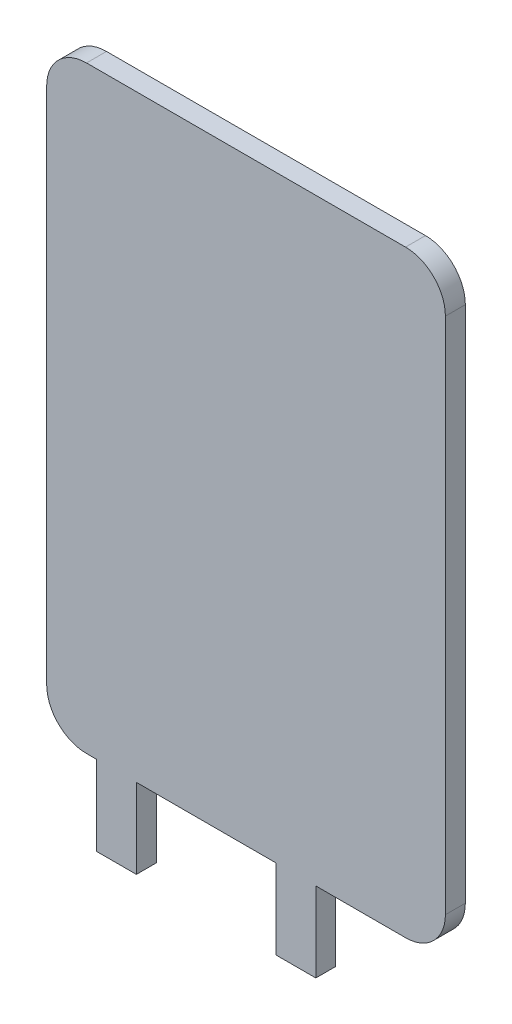
ISO-10303-21;
HEADER;
FILE_DESCRIPTION(('STEP AP214'),'2;1');
FILE_NAME('part.step','',(''),(''),'','','');
FILE_SCHEMA(('AUTOMOTIVE_DESIGN { 1 0 10303 214 1 1 1 1 }'));
ENDSEC;
DATA;
#1=APPLICATION_CONTEXT('core data for automotive mechanical design processes');
#2=APPLICATION_PROTOCOL_DEFINITION('international standard','automotive_design',2000,#1);
#3=PRODUCT_CONTEXT('',#1,'mechanical');
#4=PRODUCT('Part','Part','',(#3));
#5=PRODUCT_RELATED_PRODUCT_CATEGORY('part','',(#4));
#6=PRODUCT_DEFINITION_FORMATION('','',#4);
#7=PRODUCT_DEFINITION_CONTEXT('part definition',#1,'design');
#8=PRODUCT_DEFINITION('design','',#6,#7);
#9=PRODUCT_DEFINITION_SHAPE('','',#8);
#10=(LENGTH_UNIT() NAMED_UNIT(*) SI_UNIT(.MILLI.,.METRE.));
#11=(NAMED_UNIT(*) PLANE_ANGLE_UNIT() SI_UNIT($,.RADIAN.));
#12=(NAMED_UNIT(*) SI_UNIT($,.STERADIAN.) SOLID_ANGLE_UNIT());
#13=UNCERTAINTY_MEASURE_WITH_UNIT(LENGTH_MEASURE(1.E-05),#10,'distance_accuracy_value','');
#14=(GEOMETRIC_REPRESENTATION_CONTEXT(3) GLOBAL_UNCERTAINTY_ASSIGNED_CONTEXT((#13)) GLOBAL_UNIT_ASSIGNED_CONTEXT((#10,
#11,#12)) REPRESENTATION_CONTEXT('',''));
#15=CARTESIAN_POINT('',(0.,0.,0.));
#16=DIRECTION('',(0.,0.,1.));
#17=DIRECTION('',(1.,0.,0.));
#18=AXIS2_PLACEMENT_3D('',#15,#16,#17);
#19=CARTESIAN_POINT('',(20.,0.,2.));
#20=DIRECTION('',(1.,0.,0.));
#21=DIRECTION('',(0.,1.,0.));
#22=AXIS2_PLACEMENT_3D('',#19,#20,#21);
#23=PLANE('',#22);
#24=DIRECTION('',(0.,-1.,0.));
#25=VECTOR('',#24,1.);
#26=CARTESIAN_POINT('',(20.,0.,2.));
#27=LINE('',#26,#25);
#28=CARTESIAN_POINT('',(20.,26.,2.));
#29=VERTEX_POINT('',#28);
#30=CARTESIAN_POINT('',(20.,-26.,2.));
#31=VERTEX_POINT('',#30);
#32=EDGE_CURVE('E276',#29,#31,#27,.T.);
#33=ORIENTED_EDGE('',*,*,#32,.T.);
#34=DIRECTION('',(0.,0.,-1.));
#35=VECTOR('',#34,1.);
#36=CARTESIAN_POINT('',(20.,-26.,0.));
#37=LINE('',#36,#35);
#38=CARTESIAN_POINT('',(20.,-26.,0.));
#39=VERTEX_POINT('',#38);
#40=EDGE_CURVE('E231',#31,#39,#37,.T.);
#41=ORIENTED_EDGE('',*,*,#40,.T.);
#42=DIRECTION('',(0.,-1.,0.));
#43=VECTOR('',#42,1.);
#44=CARTESIAN_POINT('',(20.,0.,0.));
#45=LINE('',#44,#43);
#46=CARTESIAN_POINT('',(20.,26.,0.));
#47=VERTEX_POINT('',#46);
#48=EDGE_CURVE('E188',#47,#39,#45,.T.);
#49=ORIENTED_EDGE('',*,*,#48,.F.);
#50=DIRECTION('',(0.,0.,-1.));
#51=VECTOR('',#50,1.);
#52=CARTESIAN_POINT('',(20.,26.,2.));
#53=LINE('',#52,#51);
#54=EDGE_CURVE('E167',#47,#29,#53,.F.);
#55=ORIENTED_EDGE('',*,*,#54,.T.);
#56=EDGE_LOOP('',(#33,#41,#49,#55));
#57=FACE_BOUND('',#56,.T.);
#58=ADVANCED_FACE('F35',(#57),#23,.T.);
#59=CARTESIAN_POINT('',(0.,30.,2.));
#60=DIRECTION('',(0.,1.,0.));
#61=DIRECTION('',(0.,0.,1.));
#62=AXIS2_PLACEMENT_3D('',#59,#60,#61);
#63=PLANE('',#62);
#64=DIRECTION('',(1.,0.,0.));
#65=VECTOR('',#64,1.);
#66=CARTESIAN_POINT('',(0.,30.,0.));
#67=LINE('',#66,#65);
#68=CARTESIAN_POINT('',(-16.,30.,0.));
#69=VERTEX_POINT('',#68);
#70=CARTESIAN_POINT('',(16.,30.,0.));
#71=VERTEX_POINT('',#70);
#72=EDGE_CURVE('E191',#69,#71,#67,.T.);
#73=ORIENTED_EDGE('',*,*,#72,.F.);
#74=DIRECTION('',(0.,0.,-1.));
#75=VECTOR('',#74,1.);
#76=CARTESIAN_POINT('',(-16.,30.,2.));
#77=LINE('',#76,#75);
#78=CARTESIAN_POINT('',(-16.,30.,2.));
#79=VERTEX_POINT('',#78);
#80=EDGE_CURVE('E11',#69,#79,#77,.F.);
#81=ORIENTED_EDGE('',*,*,#80,.T.);
#82=DIRECTION('',(1.,0.,0.));
#83=VECTOR('',#82,1.);
#84=CARTESIAN_POINT('',(0.,30.,2.));
#85=LINE('',#84,#83);
#86=CARTESIAN_POINT('',(16.,30.,2.));
#87=VERTEX_POINT('',#86);
#88=EDGE_CURVE('E264',#79,#87,#85,.T.);
#89=ORIENTED_EDGE('',*,*,#88,.T.);
#90=DIRECTION('',(0.,0.,-1.));
#91=VECTOR('',#90,1.);
#92=CARTESIAN_POINT('',(16.,30.,2.));
#93=LINE('',#92,#91);
#94=EDGE_CURVE('E43',#87,#71,#93,.T.);
#95=ORIENTED_EDGE('',*,*,#94,.T.);
#96=EDGE_LOOP('',(#73,#81,#89,#95));
#97=FACE_BOUND('',#96,.T.);
#98=ADVANCED_FACE('F261',(#97),#63,.T.);
#99=CARTESIAN_POINT('',(-20.,0.,2.));
#100=DIRECTION('',(1.,0.,0.));
#101=DIRECTION('',(0.,1.,0.));
#102=AXIS2_PLACEMENT_3D('',#99,#100,#101);
#103=PLANE('',#102);
#104=DIRECTION('',(0.,-1.,0.));
#105=VECTOR('',#104,1.);
#106=CARTESIAN_POINT('',(-20.,0.,0.));
#107=LINE('',#106,#105);
#108=CARTESIAN_POINT('',(-20.,26.,0.));
#109=VERTEX_POINT('',#108);
#110=CARTESIAN_POINT('',(-20.,-26.,0.));
#111=VERTEX_POINT('',#110);
#112=EDGE_CURVE('E194',#109,#111,#107,.T.);
#113=ORIENTED_EDGE('',*,*,#112,.T.);
#114=DIRECTION('',(0.,0.,-1.));
#115=VECTOR('',#114,1.);
#116=CARTESIAN_POINT('',(-20.,-26.,2.));
#117=LINE('',#116,#115);
#118=CARTESIAN_POINT('',(-20.,-26.,2.));
#119=VERTEX_POINT('',#118);
#120=EDGE_CURVE('E58',#111,#119,#117,.F.);
#121=ORIENTED_EDGE('',*,*,#120,.T.);
#122=DIRECTION('',(0.,-1.,0.));
#123=VECTOR('',#122,1.);
#124=CARTESIAN_POINT('',(-20.,0.,2.));
#125=LINE('',#124,#123);
#126=CARTESIAN_POINT('',(-20.,26.,2.));
#127=VERTEX_POINT('',#126);
#128=EDGE_CURVE('E156',#127,#119,#125,.T.);
#129=ORIENTED_EDGE('',*,*,#128,.F.);
#130=DIRECTION('',(0.,0.,-1.));
#131=VECTOR('',#130,1.);
#132=CARTESIAN_POINT('',(-20.,26.,0.));
#133=LINE('',#132,#131);
#134=EDGE_CURVE('E253',#127,#109,#133,.T.);
#135=ORIENTED_EDGE('',*,*,#134,.T.);
#136=EDGE_LOOP('',(#113,#121,#129,#135));
#137=FACE_BOUND('',#136,.T.);
#138=ADVANCED_FACE('F275',(#137),#103,.F.);
#139=CARTESIAN_POINT('',(0.,-30.,2.));
#140=DIRECTION('',(0.,1.,0.));
#141=DIRECTION('',(0.,0.,1.));
#142=AXIS2_PLACEMENT_3D('',#139,#140,#141);
#143=PLANE('',#142);
#144=DIRECTION('',(1.,0.,0.));
#145=VECTOR('',#144,1.);
#146=CARTESIAN_POINT('',(0.,-30.,2.));
#147=LINE('',#146,#145);
#148=CARTESIAN_POINT('',(-16.,-30.,2.));
#149=VERTEX_POINT('',#148);
#150=CARTESIAN_POINT('',(-15.,-30.,2.));
#151=VERTEX_POINT('',#150);
#152=EDGE_CURVE('E146',#149,#151,#147,.T.);
#153=ORIENTED_EDGE('',*,*,#152,.F.);
#154=DIRECTION('',(0.,0.,-1.));
#155=VECTOR('',#154,1.);
#156=CARTESIAN_POINT('',(-16.,-30.,2.));
#157=LINE('',#156,#155);
#158=CARTESIAN_POINT('',(-16.,-30.,0.));
#159=VERTEX_POINT('',#158);
#160=EDGE_CURVE('E251',#149,#159,#157,.T.);
#161=ORIENTED_EDGE('',*,*,#160,.T.);
#162=DIRECTION('',(1.,0.,0.));
#163=VECTOR('',#162,1.);
#164=CARTESIAN_POINT('',(0.,-30.,0.));
#165=LINE('',#164,#163);
#166=CARTESIAN_POINT('',(-15.,-30.,0.));
#167=VERTEX_POINT('',#166);
#168=EDGE_CURVE('E164',#159,#167,#165,.T.);
#169=ORIENTED_EDGE('',*,*,#168,.T.);
#170=DIRECTION('',(0.,0.,-1.));
#171=VECTOR('',#170,1.);
#172=CARTESIAN_POINT('',(-15.,-30.,2.));
#173=LINE('',#172,#171);
#174=EDGE_CURVE('E161',#151,#167,#173,.T.);
#175=ORIENTED_EDGE('',*,*,#174,.F.);
#176=EDGE_LOOP('',(#153,#161,#169,#175));
#177=FACE_BOUND('',#176,.T.);
#178=ADVANCED_FACE('F162',(#177),#143,.F.);
#179=CARTESIAN_POINT('',(-15.,0.,2.));
#180=DIRECTION('',(1.,0.,0.));
#181=DIRECTION('',(0.,1.,0.));
#182=AXIS2_PLACEMENT_3D('',#179,#180,#181);
#183=PLANE('',#182);
#184=DIRECTION('',(0.,-1.,0.));
#185=VECTOR('',#184,1.);
#186=CARTESIAN_POINT('',(-15.,0.,0.));
#187=LINE('',#186,#185);
#188=CARTESIAN_POINT('',(-15.,-38.,0.));
#189=VERTEX_POINT('',#188);
#190=EDGE_CURVE('E197',#167,#189,#187,.T.);
#191=ORIENTED_EDGE('',*,*,#190,.T.);
#192=DIRECTION('',(0.,0.,-1.));
#193=VECTOR('',#192,1.);
#194=CARTESIAN_POINT('',(-15.,-38.,2.));
#195=LINE('',#194,#193);
#196=CARTESIAN_POINT('',(-15.,-38.,2.));
#197=VERTEX_POINT('',#196);
#198=EDGE_CURVE('E168',#197,#189,#195,.T.);
#199=ORIENTED_EDGE('',*,*,#198,.F.);
#200=DIRECTION('',(0.,-1.,0.));
#201=VECTOR('',#200,1.);
#202=CARTESIAN_POINT('',(-15.,0.,2.));
#203=LINE('',#202,#201);
#204=EDGE_CURVE('E151',#151,#197,#203,.T.);
#205=ORIENTED_EDGE('',*,*,#204,.F.);
#206=ORIENTED_EDGE('',*,*,#174,.T.);
#207=EDGE_LOOP('',(#191,#199,#205,#206));
#208=FACE_BOUND('',#207,.T.);
#209=ADVANCED_FACE('F170',(#208),#183,.F.);
#210=CARTESIAN_POINT('',(0.,-38.,2.));
#211=DIRECTION('',(0.,1.,0.));
#212=DIRECTION('',(0.,0.,1.));
#213=AXIS2_PLACEMENT_3D('',#210,#211,#212);
#214=PLANE('',#213);
#215=DIRECTION('',(1.,0.,0.));
#216=VECTOR('',#215,1.);
#217=CARTESIAN_POINT('',(0.,-38.,0.));
#218=LINE('',#217,#216);
#219=CARTESIAN_POINT('',(-11.,-38.,0.));
#220=VERTEX_POINT('',#219);
#221=EDGE_CURVE('E201',#189,#220,#218,.T.);
#222=ORIENTED_EDGE('',*,*,#221,.T.);
#223=DIRECTION('',(0.,0.,-1.));
#224=VECTOR('',#223,1.);
#225=CARTESIAN_POINT('',(-11.,-38.,2.));
#226=LINE('',#225,#224);
#227=CARTESIAN_POINT('',(-11.,-38.,2.));
#228=VERTEX_POINT('',#227);
#229=EDGE_CURVE('E227',#228,#220,#226,.T.);
#230=ORIENTED_EDGE('',*,*,#229,.F.);
#231=DIRECTION('',(1.,0.,0.));
#232=VECTOR('',#231,1.);
#233=CARTESIAN_POINT('',(0.,-38.,2.));
#234=LINE('',#233,#232);
#235=EDGE_CURVE('E173',#197,#228,#234,.T.);
#236=ORIENTED_EDGE('',*,*,#235,.F.);
#237=ORIENTED_EDGE('',*,*,#198,.T.);
#238=EDGE_LOOP('',(#222,#230,#236,#237));
#239=FACE_BOUND('',#238,.T.);
#240=ADVANCED_FACE('F449',(#239),#214,.F.);
#241=CARTESIAN_POINT('',(-11.,0.,2.));
#242=DIRECTION('',(1.,0.,0.));
#243=DIRECTION('',(0.,1.,0.));
#244=AXIS2_PLACEMENT_3D('',#241,#242,#243);
#245=PLANE('',#244);
#246=DIRECTION('',(0.,-1.,0.));
#247=VECTOR('',#246,1.);
#248=CARTESIAN_POINT('',(-11.,0.,0.));
#249=LINE('',#248,#247);
#250=CARTESIAN_POINT('',(-11.,-30.,0.));
#251=VERTEX_POINT('',#250);
#252=EDGE_CURVE('E204',#251,#220,#249,.T.);
#253=ORIENTED_EDGE('',*,*,#252,.F.);
#254=DIRECTION('',(0.,0.,-1.));
#255=VECTOR('',#254,1.);
#256=CARTESIAN_POINT('',(-11.,-30.,2.));
#257=LINE('',#256,#255);
#258=CARTESIAN_POINT('',(-11.,-30.,2.));
#259=VERTEX_POINT('',#258);
#260=EDGE_CURVE('E225',#259,#251,#257,.T.);
#261=ORIENTED_EDGE('',*,*,#260,.F.);
#262=DIRECTION('',(0.,-1.,0.));
#263=VECTOR('',#262,1.);
#264=CARTESIAN_POINT('',(-11.,0.,2.));
#265=LINE('',#264,#263);
#266=EDGE_CURVE('E175',#259,#228,#265,.T.);
#267=ORIENTED_EDGE('',*,*,#266,.T.);
#268=ORIENTED_EDGE('',*,*,#229,.T.);
#269=EDGE_LOOP('',(#253,#261,#267,#268));
#270=FACE_BOUND('',#269,.T.);
#271=ADVANCED_FACE('F325',(#270),#245,.T.);
#272=CARTESIAN_POINT('',(3.,-30.,0.));
#273=VERTEX_POINT('',#272);
#274=EDGE_CURVE('E199',#251,#273,#165,.T.);
#275=ORIENTED_EDGE('',*,*,#274,.T.);
#276=DIRECTION('',(0.,0.,-1.));
#277=VECTOR('',#276,1.);
#278=CARTESIAN_POINT('',(3.,-30.,2.));
#279=LINE('',#278,#277);
#280=CARTESIAN_POINT('',(3.,-30.,2.));
#281=VERTEX_POINT('',#280);
#282=EDGE_CURVE('E222',#281,#273,#279,.T.);
#283=ORIENTED_EDGE('',*,*,#282,.F.);
#284=EDGE_CURVE('E159',#259,#281,#147,.T.);
#285=ORIENTED_EDGE('',*,*,#284,.F.);
#286=ORIENTED_EDGE('',*,*,#260,.T.);
#287=EDGE_LOOP('',(#275,#283,#285,#286));
#288=FACE_BOUND('',#287,.T.);
#289=ADVANCED_FACE('F290',(#288),#143,.F.);
#290=CARTESIAN_POINT('',(3.,0.,2.));
#291=DIRECTION('',(1.,0.,0.));
#292=DIRECTION('',(0.,1.,0.));
#293=AXIS2_PLACEMENT_3D('',#290,#291,#292);
#294=PLANE('',#293);
#295=DIRECTION('',(0.,-1.,0.));
#296=VECTOR('',#295,1.);
#297=CARTESIAN_POINT('',(3.,0.,0.));
#298=LINE('',#297,#296);
#299=CARTESIAN_POINT('',(3.,-38.,0.));
#300=VERTEX_POINT('',#299);
#301=EDGE_CURVE('E207',#273,#300,#298,.T.);
#302=ORIENTED_EDGE('',*,*,#301,.T.);
#303=DIRECTION('',(0.,0.,-1.));
#304=VECTOR('',#303,1.);
#305=CARTESIAN_POINT('',(3.,-38.,2.));
#306=LINE('',#305,#304);
#307=CARTESIAN_POINT('',(3.,-38.,2.));
#308=VERTEX_POINT('',#307);
#309=EDGE_CURVE('E219',#308,#300,#306,.T.);
#310=ORIENTED_EDGE('',*,*,#309,.F.);
#311=DIRECTION('',(0.,-1.,0.));
#312=VECTOR('',#311,1.);
#313=CARTESIAN_POINT('',(3.,0.,2.));
#314=LINE('',#313,#312);
#315=EDGE_CURVE('E181',#281,#308,#314,.T.);
#316=ORIENTED_EDGE('',*,*,#315,.F.);
#317=ORIENTED_EDGE('',*,*,#282,.T.);
#318=EDGE_LOOP('',(#302,#310,#316,#317));
#319=FACE_BOUND('',#318,.T.);
#320=ADVANCED_FACE('F296',(#319),#294,.F.);
#321=CARTESIAN_POINT('',(0.,-38.,2.));
#322=DIRECTION('',(0.,1.,0.));
#323=DIRECTION('',(-1.,0.,0.));
#324=AXIS2_PLACEMENT_3D('',#321,#322,#323);
#325=PLANE('',#324);
#326=DIRECTION('',(1.,0.,0.));
#327=VECTOR('',#326,1.);
#328=CARTESIAN_POINT('',(0.,-38.,0.));
#329=LINE('',#328,#327);
#330=CARTESIAN_POINT('',(7.,-38.,0.));
#331=VERTEX_POINT('',#330);
#332=EDGE_CURVE('E209',#300,#331,#329,.T.);
#333=ORIENTED_EDGE('',*,*,#332,.T.);
#334=DIRECTION('',(0.,0.,-1.));
#335=VECTOR('',#334,1.);
#336=CARTESIAN_POINT('',(7.,-38.,2.));
#337=LINE('',#336,#335);
#338=CARTESIAN_POINT('',(7.,-38.,2.));
#339=VERTEX_POINT('',#338);
#340=EDGE_CURVE('E217',#339,#331,#337,.T.);
#341=ORIENTED_EDGE('',*,*,#340,.F.);
#342=DIRECTION('',(1.,0.,0.));
#343=VECTOR('',#342,1.);
#344=CARTESIAN_POINT('',(0.,-38.,2.));
#345=LINE('',#344,#343);
#346=EDGE_CURVE('E183',#308,#339,#345,.T.);
#347=ORIENTED_EDGE('',*,*,#346,.F.);
#348=ORIENTED_EDGE('',*,*,#309,.T.);
#349=EDGE_LOOP('',(#333,#341,#347,#348));
#350=FACE_BOUND('',#349,.T.);
#351=ADVANCED_FACE('F302',(#350),#325,.F.);
#352=CARTESIAN_POINT('',(6.99999999999999,0.,2.));
#353=DIRECTION('',(1.,0.,0.));
#354=DIRECTION('',(0.,1.,0.));
#355=AXIS2_PLACEMENT_3D('',#352,#353,#354);
#356=PLANE('',#355);
#357=DIRECTION('',(0.,-1.,0.));
#358=VECTOR('',#357,1.);
#359=CARTESIAN_POINT('',(6.99999999999999,0.,0.));
#360=LINE('',#359,#358);
#361=CARTESIAN_POINT('',(7.,-30.,0.));
#362=VERTEX_POINT('',#361);
#363=EDGE_CURVE('E212',#362,#331,#360,.T.);
#364=ORIENTED_EDGE('',*,*,#363,.F.);
#365=DIRECTION('',(0.,0.,-1.));
#366=VECTOR('',#365,1.);
#367=CARTESIAN_POINT('',(7.,-30.,2.));
#368=LINE('',#367,#366);
#369=CARTESIAN_POINT('',(7.,-30.,2.));
#370=VERTEX_POINT('',#369);
#371=EDGE_CURVE('E215',#370,#362,#368,.T.);
#372=ORIENTED_EDGE('',*,*,#371,.F.);
#373=DIRECTION('',(0.,-1.,0.));
#374=VECTOR('',#373,1.);
#375=CARTESIAN_POINT('',(6.99999999999999,0.,2.));
#376=LINE('',#375,#374);
#377=EDGE_CURVE('E185',#370,#339,#376,.T.);
#378=ORIENTED_EDGE('',*,*,#377,.T.);
#379=ORIENTED_EDGE('',*,*,#340,.T.);
#380=EDGE_LOOP('',(#364,#372,#378,#379));
#381=FACE_BOUND('',#380,.T.);
#382=ADVANCED_FACE('F312',(#381),#356,.T.);
#383=CARTESIAN_POINT('',(16.,-30.,0.));
#384=VERTEX_POINT('',#383);
#385=EDGE_CURVE('E198',#362,#384,#165,.T.);
#386=ORIENTED_EDGE('',*,*,#385,.T.);
#387=DIRECTION('',(0.,0.,-1.));
#388=VECTOR('',#387,1.);
#389=CARTESIAN_POINT('',(16.,-30.,2.));
#390=LINE('',#389,#388);
#391=CARTESIAN_POINT('',(16.,-30.,2.));
#392=VERTEX_POINT('',#391);
#393=EDGE_CURVE('E242',#384,#392,#390,.F.);
#394=ORIENTED_EDGE('',*,*,#393,.T.);
#395=EDGE_CURVE('E158',#370,#392,#147,.T.);
#396=ORIENTED_EDGE('',*,*,#395,.F.);
#397=ORIENTED_EDGE('',*,*,#371,.T.);
#398=EDGE_LOOP('',(#386,#394,#396,#397));
#399=FACE_BOUND('',#398,.T.);
#400=ADVANCED_FACE('F313',(#399),#143,.F.);
#401=CARTESIAN_POINT('',(0.,0.,2.));
#402=DIRECTION('',(0.,0.,1.));
#403=DIRECTION('',(1.,0.,0.));
#404=AXIS2_PLACEMENT_3D('',#401,#402,#403);
#405=PLANE('',#404);
#406=ORIENTED_EDGE('',*,*,#395,.T.);
#407=CARTESIAN_POINT('',(16.,-26.,2.));
#408=DIRECTION('',(0.,0.,1.));
#409=DIRECTION('',(1.,0.,0.));
#410=AXIS2_PLACEMENT_3D('',#407,#408,#409);
#411=CIRCLE('',#410,4.);
#412=EDGE_CURVE('E249',#392,#31,#411,.T.);
#413=ORIENTED_EDGE('',*,*,#412,.T.);
#414=ORIENTED_EDGE('',*,*,#32,.F.);
#415=CARTESIAN_POINT('',(16.,26.,2.));
#416=DIRECTION('',(0.,0.,1.));
#417=DIRECTION('',(1.,0.,0.));
#418=AXIS2_PLACEMENT_3D('',#415,#416,#417);
#419=CIRCLE('',#418,4.);
#420=EDGE_CURVE('E244',#29,#87,#419,.T.);
#421=ORIENTED_EDGE('',*,*,#420,.T.);
#422=ORIENTED_EDGE('',*,*,#88,.F.);
#423=CARTESIAN_POINT('',(-16.,26.,2.));
#424=DIRECTION('',(0.,0.,1.));
#425=DIRECTION('',(1.,0.,0.));
#426=AXIS2_PLACEMENT_3D('',#423,#424,#425);
#427=CIRCLE('',#426,4.);
#428=EDGE_CURVE('E246',#79,#127,#427,.T.);
#429=ORIENTED_EDGE('',*,*,#428,.T.);
#430=ORIENTED_EDGE('',*,*,#128,.T.);
#431=CARTESIAN_POINT('',(-16.,-26.,2.));
#432=DIRECTION('',(0.,0.,1.));
#433=DIRECTION('',(1.,0.,0.));
#434=AXIS2_PLACEMENT_3D('',#431,#432,#433);
#435=CIRCLE('',#434,4.);
#436=EDGE_CURVE('E50',#119,#149,#435,.T.);
#437=ORIENTED_EDGE('',*,*,#436,.T.);
#438=ORIENTED_EDGE('',*,*,#152,.T.);
#439=ORIENTED_EDGE('',*,*,#204,.T.);
#440=ORIENTED_EDGE('',*,*,#235,.T.);
#441=ORIENTED_EDGE('',*,*,#266,.F.);
#442=ORIENTED_EDGE('',*,*,#284,.T.);
#443=ORIENTED_EDGE('',*,*,#315,.T.);
#444=ORIENTED_EDGE('',*,*,#346,.T.);
#445=ORIENTED_EDGE('',*,*,#377,.F.);
#446=EDGE_LOOP('',(#406,#413,#414,#421,#422,#429,#430,#437,#438,#439,#440,#441,#442,#443,#444,#445));
#447=FACE_BOUND('',#446,.T.);
#448=ADVANCED_FACE('F149',(#447),#405,.T.);
#449=CARTESIAN_POINT('',(0.,0.,0.));
#450=DIRECTION('',(0.,0.,1.));
#451=DIRECTION('',(1.,0.,0.));
#452=AXIS2_PLACEMENT_3D('',#449,#450,#451);
#453=PLANE('',#452);
#454=ORIENTED_EDGE('',*,*,#48,.T.);
#455=CARTESIAN_POINT('',(16.,-26.,0.));
#456=DIRECTION('',(0.,0.,1.));
#457=DIRECTION('',(1.,0.,0.));
#458=AXIS2_PLACEMENT_3D('',#455,#456,#457);
#459=CIRCLE('',#458,4.);
#460=EDGE_CURVE('E240',#39,#384,#459,.F.);
#461=ORIENTED_EDGE('',*,*,#460,.T.);
#462=ORIENTED_EDGE('',*,*,#385,.F.);
#463=ORIENTED_EDGE('',*,*,#363,.T.);
#464=ORIENTED_EDGE('',*,*,#332,.F.);
#465=ORIENTED_EDGE('',*,*,#301,.F.);
#466=ORIENTED_EDGE('',*,*,#274,.F.);
#467=ORIENTED_EDGE('',*,*,#252,.T.);
#468=ORIENTED_EDGE('',*,*,#221,.F.);
#469=ORIENTED_EDGE('',*,*,#190,.F.);
#470=ORIENTED_EDGE('',*,*,#168,.F.);
#471=CARTESIAN_POINT('',(-16.,-26.,0.));
#472=DIRECTION('',(0.,0.,1.));
#473=DIRECTION('',(1.,0.,0.));
#474=AXIS2_PLACEMENT_3D('',#471,#472,#473);
#475=CIRCLE('',#474,4.);
#476=EDGE_CURVE('E238',#159,#111,#475,.F.);
#477=ORIENTED_EDGE('',*,*,#476,.T.);
#478=ORIENTED_EDGE('',*,*,#112,.F.);
#479=CARTESIAN_POINT('',(-16.,26.,0.));
#480=DIRECTION('',(0.,0.,1.));
#481=DIRECTION('',(1.,0.,0.));
#482=AXIS2_PLACEMENT_3D('',#479,#480,#481);
#483=CIRCLE('',#482,4.);
#484=EDGE_CURVE('E236',#109,#69,#483,.F.);
#485=ORIENTED_EDGE('',*,*,#484,.T.);
#486=ORIENTED_EDGE('',*,*,#72,.T.);
#487=CARTESIAN_POINT('',(16.,26.,0.));
#488=DIRECTION('',(0.,0.,1.));
#489=DIRECTION('',(1.,0.,0.));
#490=AXIS2_PLACEMENT_3D('',#487,#488,#489);
#491=CIRCLE('',#490,4.);
#492=EDGE_CURVE('E234',#71,#47,#491,.F.);
#493=ORIENTED_EDGE('',*,*,#492,.T.);
#494=EDGE_LOOP('',(#454,#461,#462,#463,#464,#465,#466,#467,#468,#469,#470,#477,#478,#485,#486,#493));
#495=FACE_BOUND('',#494,.T.);
#496=ADVANCED_FACE('F268',(#495),#453,.F.);
#497=CARTESIAN_POINT('',(16.,-26.,2.));
#498=DIRECTION('',(0.,0.,1.));
#499=DIRECTION('',(1.,0.,0.));
#500=AXIS2_PLACEMENT_3D('',#497,#498,#499);
#501=CYLINDRICAL_SURFACE('',#500,4.);
#502=ORIENTED_EDGE('',*,*,#412,.F.);
#503=ORIENTED_EDGE('',*,*,#393,.F.);
#504=ORIENTED_EDGE('',*,*,#460,.F.);
#505=ORIENTED_EDGE('',*,*,#40,.F.);
#506=EDGE_LOOP('',(#502,#503,#504,#505));
#507=FACE_BOUND('',#506,.T.);
#508=ADVANCED_FACE('F309',(#507),#501,.T.);
#509=CARTESIAN_POINT('',(-16.,-26.,2.));
#510=DIRECTION('',(0.,0.,-1.));
#511=DIRECTION('',(-1.,0.,0.));
#512=AXIS2_PLACEMENT_3D('',#509,#510,#511);
#513=CYLINDRICAL_SURFACE('',#512,4.);
#514=ORIENTED_EDGE('',*,*,#436,.F.);
#515=ORIENTED_EDGE('',*,*,#120,.F.);
#516=ORIENTED_EDGE('',*,*,#476,.F.);
#517=ORIENTED_EDGE('',*,*,#160,.F.);
#518=EDGE_LOOP('',(#514,#515,#516,#517));
#519=FACE_BOUND('',#518,.T.);
#520=ADVANCED_FACE('F336',(#519),#513,.T.);
#521=CARTESIAN_POINT('',(-16.,26.,2.));
#522=DIRECTION('',(0.,0.,1.));
#523=DIRECTION('',(1.,0.,0.));
#524=AXIS2_PLACEMENT_3D('',#521,#522,#523);
#525=CYLINDRICAL_SURFACE('',#524,4.);
#526=ORIENTED_EDGE('',*,*,#428,.F.);
#527=ORIENTED_EDGE('',*,*,#80,.F.);
#528=ORIENTED_EDGE('',*,*,#484,.F.);
#529=ORIENTED_EDGE('',*,*,#134,.F.);
#530=EDGE_LOOP('',(#526,#527,#528,#529));
#531=FACE_BOUND('',#530,.T.);
#532=ADVANCED_FACE('F274',(#531),#525,.T.);
#533=CARTESIAN_POINT('',(16.,26.,2.));
#534=DIRECTION('',(0.,0.,-1.));
#535=DIRECTION('',(-1.,0.,0.));
#536=AXIS2_PLACEMENT_3D('',#533,#534,#535);
#537=CYLINDRICAL_SURFACE('',#536,4.);
#538=ORIENTED_EDGE('',*,*,#420,.F.);
#539=ORIENTED_EDGE('',*,*,#54,.F.);
#540=ORIENTED_EDGE('',*,*,#492,.F.);
#541=ORIENTED_EDGE('',*,*,#94,.F.);
#542=EDGE_LOOP('',(#538,#539,#540,#541));
#543=FACE_BOUND('',#542,.T.);
#544=ADVANCED_FACE('F37',(#543),#537,.T.);
#545=CLOSED_SHELL('',(#58,#98,#138,#178,#209,#240,#271,#289,#320,#351,#382,#400,#448,#496,#508,
#520,#532,#544));
#546=MANIFOLD_SOLID_BREP('B2',#545);
#547=ADVANCED_BREP_SHAPE_REPRESENTATION('',(#18,#546),#14);
#548=SHAPE_DEFINITION_REPRESENTATION(#9,#547);
ENDSEC;
END-ISO-10303-21;
